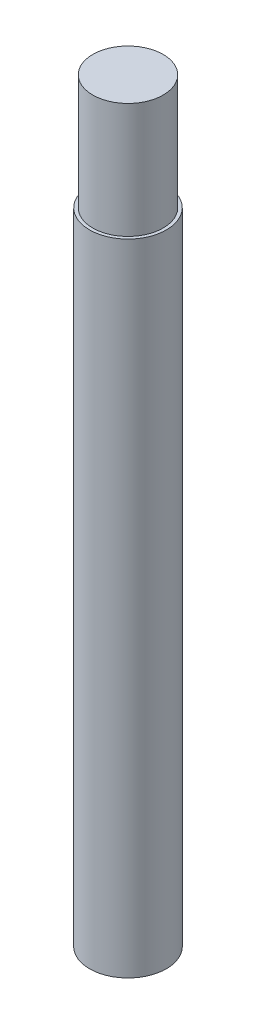
ISO-10303-21;
HEADER;
FILE_DESCRIPTION(('STEP AP214'),'2;1');
FILE_NAME('part.step','',(''),(''),'','','');
FILE_SCHEMA(('AUTOMOTIVE_DESIGN { 1 0 10303 214 1 1 1 1 }'));
ENDSEC;
DATA;
#1=APPLICATION_CONTEXT('core data for automotive mechanical design processes');
#2=APPLICATION_PROTOCOL_DEFINITION('international standard','automotive_design',2000,#1);
#3=PRODUCT_CONTEXT('',#1,'mechanical');
#4=PRODUCT('Part','Part','',(#3));
#5=PRODUCT_RELATED_PRODUCT_CATEGORY('part','',(#4));
#6=PRODUCT_DEFINITION_FORMATION('','',#4);
#7=PRODUCT_DEFINITION_CONTEXT('part definition',#1,'design');
#8=PRODUCT_DEFINITION('design','',#6,#7);
#9=PRODUCT_DEFINITION_SHAPE('','',#8);
#10=(LENGTH_UNIT() NAMED_UNIT(*) SI_UNIT(.MILLI.,.METRE.));
#11=(NAMED_UNIT(*) PLANE_ANGLE_UNIT() SI_UNIT($,.RADIAN.));
#12=(NAMED_UNIT(*) SI_UNIT($,.STERADIAN.) SOLID_ANGLE_UNIT());
#13=UNCERTAINTY_MEASURE_WITH_UNIT(LENGTH_MEASURE(1.E-05),#10,'distance_accuracy_value','');
#14=(GEOMETRIC_REPRESENTATION_CONTEXT(3) GLOBAL_UNCERTAINTY_ASSIGNED_CONTEXT((#13)) GLOBAL_UNIT_ASSIGNED_CONTEXT((#10,
#11,#12)) REPRESENTATION_CONTEXT('',''));
#15=CARTESIAN_POINT('',(0.,0.,0.));
#16=DIRECTION('',(0.,0.,1.));
#17=DIRECTION('',(1.,0.,0.));
#18=AXIS2_PLACEMENT_3D('',#15,#16,#17);
#19=CARTESIAN_POINT('',(0.,50.,0.));
#20=DIRECTION('',(0.,1.,0.));
#21=DIRECTION('',(0.,0.,1.));
#22=AXIS2_PLACEMENT_3D('',#19,#20,#21);
#23=PLANE('',#22);
#24=CARTESIAN_POINT('',(0.,50.,0.));
#25=DIRECTION('',(0.,1.,0.));
#26=DIRECTION('',(0.,0.,1.));
#27=AXIS2_PLACEMENT_3D('',#24,#25,#26);
#28=CIRCLE('',#27,3.);
#29=CARTESIAN_POINT('',(0.,50.,3.));
#30=VERTEX_POINT('',#29);
#31=EDGE_CURVE('E10',#30,#30,#28,.T.);
#32=ORIENTED_EDGE('',*,*,#31,.T.);
#33=EDGE_LOOP('',(#32));
#34=FACE_BOUND('',#33,.T.);
#35=CARTESIAN_POINT('',(0.,50.,0.));
#36=DIRECTION('',(0.,1.,0.));
#37=DIRECTION('',(0.,0.,1.));
#38=AXIS2_PLACEMENT_3D('',#35,#36,#37);
#39=CIRCLE('',#38,2.75);
#40=CARTESIAN_POINT('',(0.,50.,2.75));
#41=VERTEX_POINT('',#40);
#42=EDGE_CURVE('E48',#41,#41,#39,.T.);
#43=ORIENTED_EDGE('',*,*,#42,.F.);
#44=EDGE_LOOP('',(#43));
#45=FACE_BOUND('',#44,.T.);
#46=ADVANCED_FACE('F35',(#34,#45),#23,.T.);
#47=CARTESIAN_POINT('',(0.,50.,0.));
#48=DIRECTION('',(0.,-1.,0.));
#49=DIRECTION('',(0.,0.,-1.));
#50=AXIS2_PLACEMENT_3D('',#47,#48,#49);
#51=CYLINDRICAL_SURFACE('',#50,3.);
#52=ORIENTED_EDGE('',*,*,#31,.F.);
#53=EDGE_LOOP('',(#52));
#54=FACE_BOUND('',#53,.T.);
#55=CARTESIAN_POINT('',(0.,0.,0.));
#56=DIRECTION('',(0.,1.,0.));
#57=DIRECTION('',(0.,0.,1.));
#58=AXIS2_PLACEMENT_3D('',#55,#56,#57);
#59=CIRCLE('',#58,3.);
#60=CARTESIAN_POINT('',(0.,0.,3.));
#61=VERTEX_POINT('',#60);
#62=EDGE_CURVE('E39',#61,#61,#59,.T.);
#63=ORIENTED_EDGE('',*,*,#62,.T.);
#64=EDGE_LOOP('',(#63));
#65=FACE_BOUND('',#64,.T.);
#66=ADVANCED_FACE('F37',(#54,#65),#51,.T.);
#67=CARTESIAN_POINT('',(0.,0.,0.));
#68=DIRECTION('',(0.,1.,0.));
#69=DIRECTION('',(0.,0.,1.));
#70=AXIS2_PLACEMENT_3D('',#67,#68,#69);
#71=PLANE('',#70);
#72=ORIENTED_EDGE('',*,*,#62,.F.);
#73=EDGE_LOOP('',(#72));
#74=FACE_BOUND('',#73,.T.);
#75=ADVANCED_FACE('F59',(#74),#71,.F.);
#76=CARTESIAN_POINT('',(0.,59.,0.));
#77=DIRECTION('',(0.,-1.,0.));
#78=DIRECTION('',(0.,0.,-1.));
#79=AXIS2_PLACEMENT_3D('',#76,#77,#78);
#80=CYLINDRICAL_SURFACE('',#79,2.75);
#81=CARTESIAN_POINT('',(0.,59.,0.));
#82=DIRECTION('',(0.,1.,0.));
#83=DIRECTION('',(0.,0.,1.));
#84=AXIS2_PLACEMENT_3D('',#81,#82,#83);
#85=CIRCLE('',#84,2.75);
#86=CARTESIAN_POINT('',(0.,59.,2.75));
#87=VERTEX_POINT('',#86);
#88=EDGE_CURVE('E46',#87,#87,#85,.T.);
#89=ORIENTED_EDGE('',*,*,#88,.F.);
#90=EDGE_LOOP('',(#89));
#91=FACE_BOUND('',#90,.T.);
#92=ORIENTED_EDGE('',*,*,#42,.T.);
#93=EDGE_LOOP('',(#92));
#94=FACE_BOUND('',#93,.T.);
#95=ADVANCED_FACE('F56',(#91,#94),#80,.T.);
#96=CARTESIAN_POINT('',(0.,59.,0.));
#97=DIRECTION('',(0.,1.,0.));
#98=DIRECTION('',(0.,0.,1.));
#99=AXIS2_PLACEMENT_3D('',#96,#97,#98);
#100=PLANE('',#99);
#101=ORIENTED_EDGE('',*,*,#88,.T.);
#102=EDGE_LOOP('',(#101));
#103=FACE_BOUND('',#102,.T.);
#104=ADVANCED_FACE('F54',(#103),#100,.T.);
#105=CLOSED_SHELL('',(#46,#66,#75,#95,#104));
#106=MANIFOLD_SOLID_BREP('B2',#105);
#107=ADVANCED_BREP_SHAPE_REPRESENTATION('',(#18,#106),#14);
#108=SHAPE_DEFINITION_REPRESENTATION(#9,#107);
ENDSEC;
END-ISO-10303-21;
